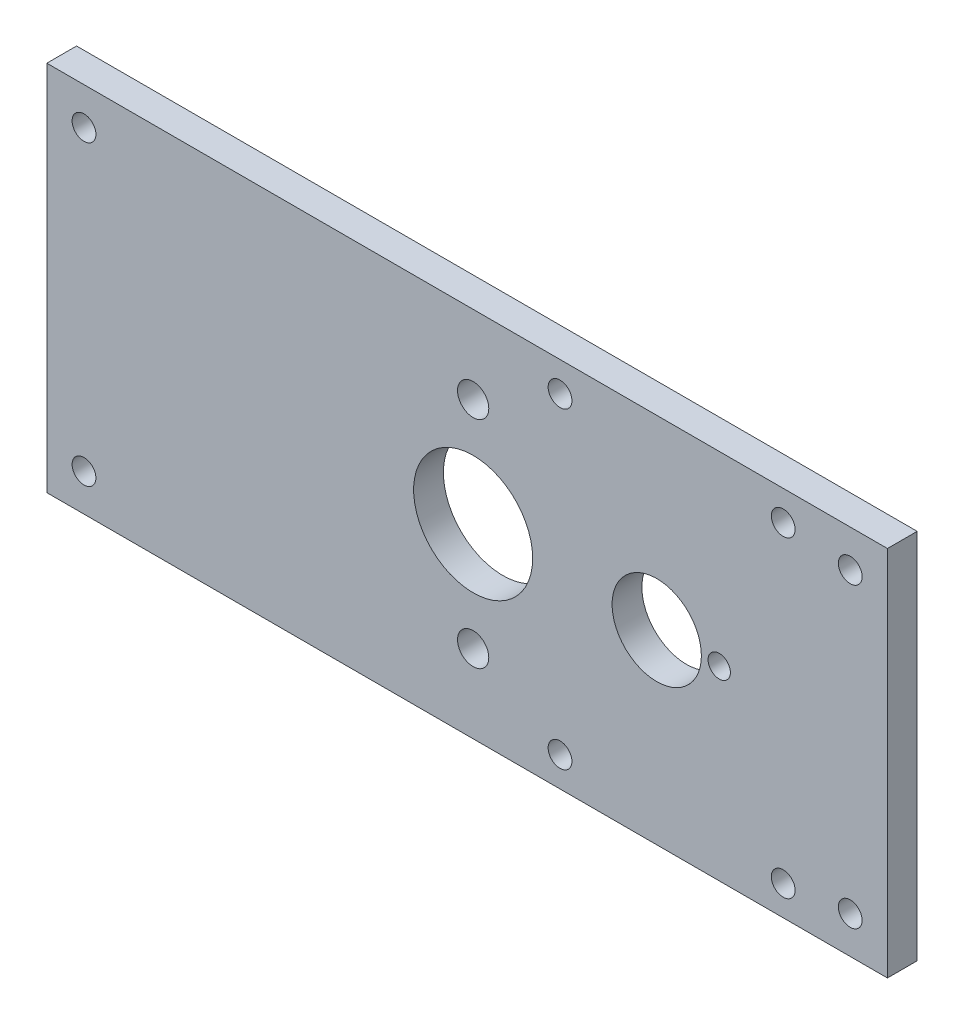
ISO-10303-21;
HEADER;
FILE_DESCRIPTION(('STEP AP214'),'2;1');
FILE_NAME('part.step','',(''),(''),'','','');
FILE_SCHEMA(('AUTOMOTIVE_DESIGN { 1 0 10303 214 1 1 1 1 }'));
ENDSEC;
DATA;
#1=APPLICATION_CONTEXT('core data for automotive mechanical design processes');
#2=APPLICATION_PROTOCOL_DEFINITION('international standard','automotive_design',2000,#1);
#3=PRODUCT_CONTEXT('',#1,'mechanical');
#4=PRODUCT('Part','Part','',(#3));
#5=PRODUCT_RELATED_PRODUCT_CATEGORY('part','',(#4));
#6=PRODUCT_DEFINITION_FORMATION('','',#4);
#7=PRODUCT_DEFINITION_CONTEXT('part definition',#1,'design');
#8=PRODUCT_DEFINITION('design','',#6,#7);
#9=PRODUCT_DEFINITION_SHAPE('','',#8);
#10=(LENGTH_UNIT() NAMED_UNIT(*) SI_UNIT(.MILLI.,.METRE.));
#11=(NAMED_UNIT(*) PLANE_ANGLE_UNIT() SI_UNIT($,.RADIAN.));
#12=(NAMED_UNIT(*) SI_UNIT($,.STERADIAN.) SOLID_ANGLE_UNIT());
#13=UNCERTAINTY_MEASURE_WITH_UNIT(LENGTH_MEASURE(1.E-05),#10,'distance_accuracy_value','');
#14=(GEOMETRIC_REPRESENTATION_CONTEXT(3) GLOBAL_UNCERTAINTY_ASSIGNED_CONTEXT((#13)) GLOBAL_UNIT_ASSIGNED_CONTEXT((#10,
#11,#12)) REPRESENTATION_CONTEXT('',''));
#15=CARTESIAN_POINT('',(0.,0.,0.));
#16=DIRECTION('',(0.,0.,1.));
#17=DIRECTION('',(1.,0.,0.));
#18=AXIS2_PLACEMENT_3D('',#15,#16,#17);
#19=CARTESIAN_POINT('',(0.,0.,4.));
#20=DIRECTION('',(0.,0.,-1.));
#21=DIRECTION('',(-1.,0.,0.));
#22=AXIS2_PLACEMENT_3D('',#19,#20,#21);
#23=PLANE('',#22);
#24=CARTESIAN_POINT('',(57.31,10.5,4.));
#25=DIRECTION('',(0.,0.,1.));
#26=DIRECTION('',(1.,0.,0.));
#27=AXIS2_PLACEMENT_3D('',#24,#25,#26);
#28=CIRCLE('',#27,2.09999999999999);
#29=CARTESIAN_POINT('',(59.41,10.5,4.));
#30=VERTEX_POINT('',#29);
#31=EDGE_CURVE('E159',#30,#30,#28,.T.);
#32=ORIENTED_EDGE('',*,*,#31,.F.);
#33=EDGE_LOOP('',(#32));
#34=FACE_BOUND('',#33,.T.);
#35=CARTESIAN_POINT('',(57.31,39.5,4.));
#36=DIRECTION('',(0.,0.,1.));
#37=DIRECTION('',(1.,0.,0.));
#38=AXIS2_PLACEMENT_3D('',#35,#36,#37);
#39=CIRCLE('',#38,2.09999999999999);
#40=CARTESIAN_POINT('',(59.41,39.5,4.));
#41=VERTEX_POINT('',#40);
#42=EDGE_CURVE('E165',#41,#41,#39,.T.);
#43=ORIENTED_EDGE('',*,*,#42,.F.);
#44=EDGE_LOOP('',(#43));
#45=FACE_BOUND('',#44,.T.);
#46=CARTESIAN_POINT('',(68.99,46.,4.));
#47=DIRECTION('',(0.,0.,1.));
#48=DIRECTION('',(1.,0.,0.));
#49=AXIS2_PLACEMENT_3D('',#46,#47,#48);
#50=CIRCLE('',#49,1.60000000000001);
#51=CARTESIAN_POINT('',(70.59,46.,4.));
#52=VERTEX_POINT('',#51);
#53=EDGE_CURVE('E171',#52,#52,#50,.T.);
#54=ORIENTED_EDGE('',*,*,#53,.F.);
#55=EDGE_LOOP('',(#54));
#56=FACE_BOUND('',#55,.T.);
#57=CARTESIAN_POINT('',(68.99,4.,4.));
#58=DIRECTION('',(0.,0.,1.));
#59=DIRECTION('',(1.,0.,0.));
#60=AXIS2_PLACEMENT_3D('',#57,#58,#59);
#61=CIRCLE('',#60,1.60000000000001);
#62=CARTESIAN_POINT('',(70.59,4.,4.));
#63=VERTEX_POINT('',#62);
#64=EDGE_CURVE('E177',#63,#63,#61,.T.);
#65=ORIENTED_EDGE('',*,*,#64,.F.);
#66=EDGE_LOOP('',(#65));
#67=FACE_BOUND('',#66,.T.);
#68=CARTESIAN_POINT('',(98.99,4.,4.));
#69=DIRECTION('',(0.,0.,1.));
#70=DIRECTION('',(1.,0.,0.));
#71=AXIS2_PLACEMENT_3D('',#68,#69,#70);
#72=CIRCLE('',#71,1.60000000000001);
#73=CARTESIAN_POINT('',(100.59,4.,4.));
#74=VERTEX_POINT('',#73);
#75=EDGE_CURVE('E183',#74,#74,#72,.T.);
#76=ORIENTED_EDGE('',*,*,#75,.F.);
#77=EDGE_LOOP('',(#76));
#78=FACE_BOUND('',#77,.T.);
#79=CARTESIAN_POINT('',(98.99,46.,4.));
#80=DIRECTION('',(0.,0.,1.));
#81=DIRECTION('',(1.,0.,0.));
#82=AXIS2_PLACEMENT_3D('',#79,#80,#81);
#83=CIRCLE('',#82,1.60000000000001);
#84=CARTESIAN_POINT('',(100.59,46.,4.));
#85=VERTEX_POINT('',#84);
#86=EDGE_CURVE('E153',#85,#85,#83,.T.);
#87=ORIENTED_EDGE('',*,*,#86,.F.);
#88=EDGE_LOOP('',(#87));
#89=FACE_BOUND('',#88,.T.);
#90=CARTESIAN_POINT('',(90.39,25.,4.));
#91=DIRECTION('',(0.,0.,1.));
#92=DIRECTION('',(1.,0.,0.));
#93=AXIS2_PLACEMENT_3D('',#90,#91,#92);
#94=CIRCLE('',#93,1.5);
#95=CARTESIAN_POINT('',(91.89,25.,4.));
#96=VERTEX_POINT('',#95);
#97=EDGE_CURVE('E150',#96,#96,#94,.T.);
#98=ORIENTED_EDGE('',*,*,#97,.F.);
#99=EDGE_LOOP('',(#98));
#100=FACE_BOUND('',#99,.T.);
#101=DIRECTION('',(0.,-1.,0.));
#102=VECTOR('',#101,1.);
#103=CARTESIAN_POINT('',(0.,0.,4.));
#104=LINE('',#103,#102);
#105=CARTESIAN_POINT('',(0.,50.,4.));
#106=VERTEX_POINT('',#105);
#107=CARTESIAN_POINT('',(0.,0.,4.));
#108=VERTEX_POINT('',#107);
#109=EDGE_CURVE('E87',#106,#108,#104,.T.);
#110=ORIENTED_EDGE('',*,*,#109,.T.);
#111=DIRECTION('',(1.,0.,0.));
#112=VECTOR('',#111,1.);
#113=CARTESIAN_POINT('',(0.,0.,4.));
#114=LINE('',#113,#112);
#115=CARTESIAN_POINT('',(113.,0.,4.));
#116=VERTEX_POINT('',#115);
#117=EDGE_CURVE('E82',#108,#116,#114,.T.);
#118=ORIENTED_EDGE('',*,*,#117,.T.);
#119=DIRECTION('',(0.,1.,0.));
#120=VECTOR('',#119,1.);
#121=CARTESIAN_POINT('',(113.,0.,4.));
#122=LINE('',#121,#120);
#123=CARTESIAN_POINT('',(113.,50.,4.));
#124=VERTEX_POINT('',#123);
#125=EDGE_CURVE('E85',#116,#124,#122,.T.);
#126=ORIENTED_EDGE('',*,*,#125,.T.);
#127=DIRECTION('',(-1.,0.,0.));
#128=VECTOR('',#127,1.);
#129=CARTESIAN_POINT('',(0.,50.,4.));
#130=LINE('',#129,#128);
#131=EDGE_CURVE('E52',#124,#106,#130,.T.);
#132=ORIENTED_EDGE('',*,*,#131,.T.);
#133=EDGE_LOOP('',(#110,#118,#126,#132));
#134=FACE_BOUND('',#133,.T.);
#135=CARTESIAN_POINT('',(5.,45.,4.));
#136=DIRECTION('',(0.,0.,1.));
#137=DIRECTION('',(1.,0.,0.));
#138=AXIS2_PLACEMENT_3D('',#135,#136,#137);
#139=CIRCLE('',#138,1.6);
#140=CARTESIAN_POINT('',(6.6,45.,4.));
#141=VERTEX_POINT('',#140);
#142=EDGE_CURVE('E102',#141,#141,#139,.T.);
#143=ORIENTED_EDGE('',*,*,#142,.F.);
#144=EDGE_LOOP('',(#143));
#145=FACE_BOUND('',#144,.T.);
#146=CARTESIAN_POINT('',(5.,5.,4.));
#147=DIRECTION('',(0.,0.,1.));
#148=DIRECTION('',(1.,0.,0.));
#149=AXIS2_PLACEMENT_3D('',#146,#147,#148);
#150=CIRCLE('',#149,1.6);
#151=CARTESIAN_POINT('',(6.6,5.,4.));
#152=VERTEX_POINT('',#151);
#153=EDGE_CURVE('E117',#152,#152,#150,.T.);
#154=ORIENTED_EDGE('',*,*,#153,.F.);
#155=EDGE_LOOP('',(#154));
#156=FACE_BOUND('',#155,.T.);
#157=CARTESIAN_POINT('',(108.,45.,4.));
#158=DIRECTION('',(0.,0.,1.));
#159=DIRECTION('',(1.,0.,0.));
#160=AXIS2_PLACEMENT_3D('',#157,#158,#159);
#161=CIRCLE('',#160,1.60000000000002);
#162=CARTESIAN_POINT('',(109.6,45.,4.));
#163=VERTEX_POINT('',#162);
#164=EDGE_CURVE('E123',#163,#163,#161,.T.);
#165=ORIENTED_EDGE('',*,*,#164,.F.);
#166=EDGE_LOOP('',(#165));
#167=FACE_BOUND('',#166,.T.);
#168=CARTESIAN_POINT('',(108.,5.,4.));
#169=DIRECTION('',(0.,0.,1.));
#170=DIRECTION('',(1.,0.,0.));
#171=AXIS2_PLACEMENT_3D('',#168,#169,#170);
#172=CIRCLE('',#171,1.60000000000002);
#173=CARTESIAN_POINT('',(109.6,5.,4.));
#174=VERTEX_POINT('',#173);
#175=EDGE_CURVE('E129',#174,#174,#172,.T.);
#176=ORIENTED_EDGE('',*,*,#175,.F.);
#177=EDGE_LOOP('',(#176));
#178=FACE_BOUND('',#177,.T.);
#179=CARTESIAN_POINT('',(57.31,25.,4.));
#180=DIRECTION('',(0.,0.,1.));
#181=DIRECTION('',(1.,0.,0.));
#182=AXIS2_PLACEMENT_3D('',#179,#180,#181);
#183=CIRCLE('',#182,8.00000000000001);
#184=CARTESIAN_POINT('',(65.31,25.,4.));
#185=VERTEX_POINT('',#184);
#186=EDGE_CURVE('E135',#185,#185,#183,.T.);
#187=ORIENTED_EDGE('',*,*,#186,.F.);
#188=EDGE_LOOP('',(#187));
#189=FACE_BOUND('',#188,.T.);
#190=CARTESIAN_POINT('',(81.99,25.,4.));
#191=DIRECTION('',(0.,0.,1.));
#192=DIRECTION('',(1.,0.,0.));
#193=AXIS2_PLACEMENT_3D('',#190,#191,#192);
#194=CIRCLE('',#193,6.);
#195=CARTESIAN_POINT('',(87.99,25.,4.));
#196=VERTEX_POINT('',#195);
#197=EDGE_CURVE('E141',#196,#196,#194,.T.);
#198=ORIENTED_EDGE('',*,*,#197,.F.);
#199=EDGE_LOOP('',(#198));
#200=FACE_BOUND('',#199,.T.);
#201=ADVANCED_FACE('F35',(#34,#45,#56,#67,#78,#89,#100,#134,#145,#156,#167,#178,#189,#200),#23,.F.);
#202=CARTESIAN_POINT('',(0.,0.,0.));
#203=DIRECTION('',(0.,0.,-1.));
#204=DIRECTION('',(-1.,0.,0.));
#205=AXIS2_PLACEMENT_3D('',#202,#203,#204);
#206=PLANE('',#205);
#207=CARTESIAN_POINT('',(57.31,10.5,0.));
#208=DIRECTION('',(0.,0.,1.));
#209=DIRECTION('',(1.,0.,0.));
#210=AXIS2_PLACEMENT_3D('',#207,#208,#209);
#211=CIRCLE('',#210,2.09999999999999);
#212=CARTESIAN_POINT('',(59.41,10.5,0.));
#213=VERTEX_POINT('',#212);
#214=EDGE_CURVE('E156',#213,#213,#211,.T.);
#215=ORIENTED_EDGE('',*,*,#214,.T.);
#216=EDGE_LOOP('',(#215));
#217=FACE_BOUND('',#216,.T.);
#218=CARTESIAN_POINT('',(57.31,39.5,0.));
#219=DIRECTION('',(0.,0.,1.));
#220=DIRECTION('',(1.,0.,0.));
#221=AXIS2_PLACEMENT_3D('',#218,#219,#220);
#222=CIRCLE('',#221,2.09999999999999);
#223=CARTESIAN_POINT('',(59.41,39.5,0.));
#224=VERTEX_POINT('',#223);
#225=EDGE_CURVE('E162',#224,#224,#222,.T.);
#226=ORIENTED_EDGE('',*,*,#225,.T.);
#227=EDGE_LOOP('',(#226));
#228=FACE_BOUND('',#227,.T.);
#229=CARTESIAN_POINT('',(68.99,46.,0.));
#230=DIRECTION('',(0.,0.,1.));
#231=DIRECTION('',(1.,0.,0.));
#232=AXIS2_PLACEMENT_3D('',#229,#230,#231);
#233=CIRCLE('',#232,1.60000000000001);
#234=CARTESIAN_POINT('',(70.59,46.,0.));
#235=VERTEX_POINT('',#234);
#236=EDGE_CURVE('E168',#235,#235,#233,.T.);
#237=ORIENTED_EDGE('',*,*,#236,.T.);
#238=EDGE_LOOP('',(#237));
#239=FACE_BOUND('',#238,.T.);
#240=CARTESIAN_POINT('',(68.99,4.,0.));
#241=DIRECTION('',(0.,0.,1.));
#242=DIRECTION('',(1.,0.,0.));
#243=AXIS2_PLACEMENT_3D('',#240,#241,#242);
#244=CIRCLE('',#243,1.60000000000001);
#245=CARTESIAN_POINT('',(70.59,4.,0.));
#246=VERTEX_POINT('',#245);
#247=EDGE_CURVE('E174',#246,#246,#244,.T.);
#248=ORIENTED_EDGE('',*,*,#247,.T.);
#249=EDGE_LOOP('',(#248));
#250=FACE_BOUND('',#249,.T.);
#251=CARTESIAN_POINT('',(98.99,4.,0.));
#252=DIRECTION('',(0.,0.,1.));
#253=DIRECTION('',(1.,0.,0.));
#254=AXIS2_PLACEMENT_3D('',#251,#252,#253);
#255=CIRCLE('',#254,1.60000000000001);
#256=CARTESIAN_POINT('',(100.59,4.,0.));
#257=VERTEX_POINT('',#256);
#258=EDGE_CURVE('E180',#257,#257,#255,.T.);
#259=ORIENTED_EDGE('',*,*,#258,.T.);
#260=EDGE_LOOP('',(#259));
#261=FACE_BOUND('',#260,.T.);
#262=CARTESIAN_POINT('',(98.99,46.,0.));
#263=DIRECTION('',(0.,0.,1.));
#264=DIRECTION('',(1.,0.,0.));
#265=AXIS2_PLACEMENT_3D('',#262,#263,#264);
#266=CIRCLE('',#265,1.60000000000001);
#267=CARTESIAN_POINT('',(100.59,46.,0.));
#268=VERTEX_POINT('',#267);
#269=EDGE_CURVE('E186',#268,#268,#266,.T.);
#270=ORIENTED_EDGE('',*,*,#269,.T.);
#271=EDGE_LOOP('',(#270));
#272=FACE_BOUND('',#271,.T.);
#273=CARTESIAN_POINT('',(90.39,25.,0.));
#274=DIRECTION('',(0.,0.,1.));
#275=DIRECTION('',(1.,0.,0.));
#276=AXIS2_PLACEMENT_3D('',#273,#274,#275);
#277=CIRCLE('',#276,1.5);
#278=CARTESIAN_POINT('',(91.89,25.,0.));
#279=VERTEX_POINT('',#278);
#280=EDGE_CURVE('E147',#279,#279,#277,.T.);
#281=ORIENTED_EDGE('',*,*,#280,.T.);
#282=EDGE_LOOP('',(#281));
#283=FACE_BOUND('',#282,.T.);
#284=CARTESIAN_POINT('',(57.31,25.,0.));
#285=DIRECTION('',(0.,0.,1.));
#286=DIRECTION('',(1.,0.,0.));
#287=AXIS2_PLACEMENT_3D('',#284,#285,#286);
#288=CIRCLE('',#287,8.00000000000001);
#289=CARTESIAN_POINT('',(65.31,25.,0.));
#290=VERTEX_POINT('',#289);
#291=EDGE_CURVE('E138',#290,#290,#288,.T.);
#292=ORIENTED_EDGE('',*,*,#291,.T.);
#293=EDGE_LOOP('',(#292));
#294=FACE_BOUND('',#293,.T.);
#295=CARTESIAN_POINT('',(108.,45.,0.));
#296=DIRECTION('',(0.,0.,1.));
#297=DIRECTION('',(1.,0.,0.));
#298=AXIS2_PLACEMENT_3D('',#295,#296,#297);
#299=CIRCLE('',#298,1.60000000000002);
#300=CARTESIAN_POINT('',(109.6,45.,0.));
#301=VERTEX_POINT('',#300);
#302=EDGE_CURVE('E126',#301,#301,#299,.T.);
#303=ORIENTED_EDGE('',*,*,#302,.T.);
#304=EDGE_LOOP('',(#303));
#305=FACE_BOUND('',#304,.T.);
#306=CARTESIAN_POINT('',(5.,45.,0.));
#307=DIRECTION('',(0.,0.,1.));
#308=DIRECTION('',(1.,0.,0.));
#309=AXIS2_PLACEMENT_3D('',#306,#307,#308);
#310=CIRCLE('',#309,1.6);
#311=CARTESIAN_POINT('',(6.6,45.,0.));
#312=VERTEX_POINT('',#311);
#313=EDGE_CURVE('E114',#312,#312,#310,.T.);
#314=ORIENTED_EDGE('',*,*,#313,.T.);
#315=EDGE_LOOP('',(#314));
#316=FACE_BOUND('',#315,.T.);
#317=DIRECTION('',(0.,-1.,0.));
#318=VECTOR('',#317,1.);
#319=CARTESIAN_POINT('',(0.,0.,0.));
#320=LINE('',#319,#318);
#321=CARTESIAN_POINT('',(0.,50.,0.));
#322=VERTEX_POINT('',#321);
#323=CARTESIAN_POINT('',(0.,0.,0.));
#324=VERTEX_POINT('',#323);
#325=EDGE_CURVE('E99',#322,#324,#320,.T.);
#326=ORIENTED_EDGE('',*,*,#325,.F.);
#327=DIRECTION('',(-1.,0.,0.));
#328=VECTOR('',#327,1.);
#329=CARTESIAN_POINT('',(0.,50.,0.));
#330=LINE('',#329,#328);
#331=CARTESIAN_POINT('',(113.,50.,0.));
#332=VERTEX_POINT('',#331);
#333=EDGE_CURVE('E75',#332,#322,#330,.T.);
#334=ORIENTED_EDGE('',*,*,#333,.F.);
#335=DIRECTION('',(0.,1.,0.));
#336=VECTOR('',#335,1.);
#337=CARTESIAN_POINT('',(113.,0.,0.));
#338=LINE('',#337,#336);
#339=CARTESIAN_POINT('',(113.,0.,0.));
#340=VERTEX_POINT('',#339);
#341=EDGE_CURVE('E69',#340,#332,#338,.T.);
#342=ORIENTED_EDGE('',*,*,#341,.F.);
#343=DIRECTION('',(1.,0.,0.));
#344=VECTOR('',#343,1.);
#345=CARTESIAN_POINT('',(0.,0.,0.));
#346=LINE('',#345,#344);
#347=EDGE_CURVE('E91',#324,#340,#346,.T.);
#348=ORIENTED_EDGE('',*,*,#347,.F.);
#349=EDGE_LOOP('',(#326,#334,#342,#348));
#350=FACE_BOUND('',#349,.T.);
#351=CARTESIAN_POINT('',(5.,5.,0.));
#352=DIRECTION('',(0.,0.,1.));
#353=DIRECTION('',(1.,0.,0.));
#354=AXIS2_PLACEMENT_3D('',#351,#352,#353);
#355=CIRCLE('',#354,1.6);
#356=CARTESIAN_POINT('',(6.6,5.,0.));
#357=VERTEX_POINT('',#356);
#358=EDGE_CURVE('E120',#357,#357,#355,.T.);
#359=ORIENTED_EDGE('',*,*,#358,.T.);
#360=EDGE_LOOP('',(#359));
#361=FACE_BOUND('',#360,.T.);
#362=CARTESIAN_POINT('',(108.,5.,0.));
#363=DIRECTION('',(0.,0.,1.));
#364=DIRECTION('',(1.,0.,0.));
#365=AXIS2_PLACEMENT_3D('',#362,#363,#364);
#366=CIRCLE('',#365,1.60000000000002);
#367=CARTESIAN_POINT('',(109.6,5.,0.));
#368=VERTEX_POINT('',#367);
#369=EDGE_CURVE('E132',#368,#368,#366,.T.);
#370=ORIENTED_EDGE('',*,*,#369,.T.);
#371=EDGE_LOOP('',(#370));
#372=FACE_BOUND('',#371,.T.);
#373=CARTESIAN_POINT('',(81.99,25.,0.));
#374=DIRECTION('',(0.,0.,1.));
#375=DIRECTION('',(1.,0.,0.));
#376=AXIS2_PLACEMENT_3D('',#373,#374,#375);
#377=CIRCLE('',#376,6.);
#378=CARTESIAN_POINT('',(87.99,25.,0.));
#379=VERTEX_POINT('',#378);
#380=EDGE_CURVE('E144',#379,#379,#377,.T.);
#381=ORIENTED_EDGE('',*,*,#380,.T.);
#382=EDGE_LOOP('',(#381));
#383=FACE_BOUND('',#382,.T.);
#384=ADVANCED_FACE('F110',(#217,#228,#239,#250,#261,#272,#283,#294,#305,#316,#350,#361,#372,
#383),#206,.T.);
#385=CARTESIAN_POINT('',(0.,0.,4.));
#386=DIRECTION('',(1.,0.,0.));
#387=DIRECTION('',(0.,0.,-1.));
#388=AXIS2_PLACEMENT_3D('',#385,#386,#387);
#389=PLANE('',#388);
#390=ORIENTED_EDGE('',*,*,#325,.T.);
#391=DIRECTION('',(0.,0.,-1.));
#392=VECTOR('',#391,1.);
#393=CARTESIAN_POINT('',(0.,0.,4.));
#394=LINE('',#393,#392);
#395=EDGE_CURVE('E11',#108,#324,#394,.T.);
#396=ORIENTED_EDGE('',*,*,#395,.F.);
#397=ORIENTED_EDGE('',*,*,#109,.F.);
#398=DIRECTION('',(0.,0.,-1.));
#399=VECTOR('',#398,1.);
#400=CARTESIAN_POINT('',(0.,50.,4.));
#401=LINE('',#400,#399);
#402=EDGE_CURVE('E95',#106,#322,#401,.T.);
#403=ORIENTED_EDGE('',*,*,#402,.T.);
#404=EDGE_LOOP('',(#390,#396,#397,#403));
#405=FACE_BOUND('',#404,.T.);
#406=ADVANCED_FACE('F37',(#405),#389,.F.);
#407=CARTESIAN_POINT('',(0.,0.,4.));
#408=DIRECTION('',(0.,1.,0.));
#409=DIRECTION('',(0.,0.,1.));
#410=AXIS2_PLACEMENT_3D('',#407,#408,#409);
#411=PLANE('',#410);
#412=ORIENTED_EDGE('',*,*,#347,.T.);
#413=DIRECTION('',(0.,0.,-1.));
#414=VECTOR('',#413,1.);
#415=CARTESIAN_POINT('',(113.,0.,4.));
#416=LINE('',#415,#414);
#417=EDGE_CURVE('E44',#116,#340,#416,.T.);
#418=ORIENTED_EDGE('',*,*,#417,.F.);
#419=ORIENTED_EDGE('',*,*,#117,.F.);
#420=ORIENTED_EDGE('',*,*,#395,.T.);
#421=EDGE_LOOP('',(#412,#418,#419,#420));
#422=FACE_BOUND('',#421,.T.);
#423=ADVANCED_FACE('F90',(#422),#411,.F.);
#424=CARTESIAN_POINT('',(113.,0.,4.));
#425=DIRECTION('',(-1.,0.,0.));
#426=DIRECTION('',(0.,0.,1.));
#427=AXIS2_PLACEMENT_3D('',#424,#425,#426);
#428=PLANE('',#427);
#429=ORIENTED_EDGE('',*,*,#341,.T.);
#430=DIRECTION('',(0.,0.,-1.));
#431=VECTOR('',#430,1.);
#432=CARTESIAN_POINT('',(113.,50.,4.));
#433=LINE('',#432,#431);
#434=EDGE_CURVE('E92',#124,#332,#433,.T.);
#435=ORIENTED_EDGE('',*,*,#434,.F.);
#436=ORIENTED_EDGE('',*,*,#125,.F.);
#437=ORIENTED_EDGE('',*,*,#417,.T.);
#438=EDGE_LOOP('',(#429,#435,#436,#437));
#439=FACE_BOUND('',#438,.T.);
#440=ADVANCED_FACE('F93',(#439),#428,.F.);
#441=CARTESIAN_POINT('',(0.,50.,4.));
#442=DIRECTION('',(0.,-1.,0.));
#443=DIRECTION('',(0.,0.,-1.));
#444=AXIS2_PLACEMENT_3D('',#441,#442,#443);
#445=PLANE('',#444);
#446=ORIENTED_EDGE('',*,*,#333,.T.);
#447=ORIENTED_EDGE('',*,*,#402,.F.);
#448=ORIENTED_EDGE('',*,*,#131,.F.);
#449=ORIENTED_EDGE('',*,*,#434,.T.);
#450=EDGE_LOOP('',(#446,#447,#448,#449));
#451=FACE_BOUND('',#450,.T.);
#452=ADVANCED_FACE('F107',(#451),#445,.F.);
#453=CARTESIAN_POINT('',(5.,45.,4.));
#454=DIRECTION('',(0.,0.,-1.));
#455=DIRECTION('',(-1.,0.,0.));
#456=AXIS2_PLACEMENT_3D('',#453,#454,#455);
#457=CYLINDRICAL_SURFACE('',#456,1.6);
#458=ORIENTED_EDGE('',*,*,#142,.T.);
#459=EDGE_LOOP('',(#458));
#460=FACE_BOUND('',#459,.T.);
#461=ORIENTED_EDGE('',*,*,#313,.F.);
#462=EDGE_LOOP('',(#461));
#463=FACE_BOUND('',#462,.T.);
#464=ADVANCED_FACE('F234',(#460,#463),#457,.F.);
#465=CARTESIAN_POINT('',(5.,5.,4.));
#466=DIRECTION('',(0.,0.,-1.));
#467=DIRECTION('',(-1.,0.,0.));
#468=AXIS2_PLACEMENT_3D('',#465,#466,#467);
#469=CYLINDRICAL_SURFACE('',#468,1.6);
#470=ORIENTED_EDGE('',*,*,#153,.T.);
#471=EDGE_LOOP('',(#470));
#472=FACE_BOUND('',#471,.T.);
#473=ORIENTED_EDGE('',*,*,#358,.F.);
#474=EDGE_LOOP('',(#473));
#475=FACE_BOUND('',#474,.T.);
#476=ADVANCED_FACE('F230',(#472,#475),#469,.F.);
#477=CARTESIAN_POINT('',(108.,45.,4.));
#478=DIRECTION('',(0.,0.,-1.));
#479=DIRECTION('',(-1.,0.,0.));
#480=AXIS2_PLACEMENT_3D('',#477,#478,#479);
#481=CYLINDRICAL_SURFACE('',#480,1.60000000000002);
#482=ORIENTED_EDGE('',*,*,#164,.T.);
#483=EDGE_LOOP('',(#482));
#484=FACE_BOUND('',#483,.T.);
#485=ORIENTED_EDGE('',*,*,#302,.F.);
#486=EDGE_LOOP('',(#485));
#487=FACE_BOUND('',#486,.T.);
#488=ADVANCED_FACE('F226',(#484,#487),#481,.F.);
#489=CARTESIAN_POINT('',(108.,5.,4.));
#490=DIRECTION('',(0.,0.,-1.));
#491=DIRECTION('',(-1.,0.,0.));
#492=AXIS2_PLACEMENT_3D('',#489,#490,#491);
#493=CYLINDRICAL_SURFACE('',#492,1.60000000000002);
#494=ORIENTED_EDGE('',*,*,#175,.T.);
#495=EDGE_LOOP('',(#494));
#496=FACE_BOUND('',#495,.T.);
#497=ORIENTED_EDGE('',*,*,#369,.F.);
#498=EDGE_LOOP('',(#497));
#499=FACE_BOUND('',#498,.T.);
#500=ADVANCED_FACE('F222',(#496,#499),#493,.F.);
#501=CARTESIAN_POINT('',(57.31,25.,4.));
#502=DIRECTION('',(0.,0.,-1.));
#503=DIRECTION('',(-1.,0.,0.));
#504=AXIS2_PLACEMENT_3D('',#501,#502,#503);
#505=CYLINDRICAL_SURFACE('',#504,8.00000000000001);
#506=ORIENTED_EDGE('',*,*,#186,.T.);
#507=EDGE_LOOP('',(#506));
#508=FACE_BOUND('',#507,.T.);
#509=ORIENTED_EDGE('',*,*,#291,.F.);
#510=EDGE_LOOP('',(#509));
#511=FACE_BOUND('',#510,.T.);
#512=ADVANCED_FACE('F212',(#508,#511),#505,.F.);
#513=CARTESIAN_POINT('',(81.99,25.,4.));
#514=DIRECTION('',(0.,0.,-1.));
#515=DIRECTION('',(-1.,0.,0.));
#516=AXIS2_PLACEMENT_3D('',#513,#514,#515);
#517=CYLINDRICAL_SURFACE('',#516,6.);
#518=ORIENTED_EDGE('',*,*,#197,.T.);
#519=EDGE_LOOP('',(#518));
#520=FACE_BOUND('',#519,.T.);
#521=ORIENTED_EDGE('',*,*,#380,.F.);
#522=EDGE_LOOP('',(#521));
#523=FACE_BOUND('',#522,.T.);
#524=ADVANCED_FACE('F202',(#520,#523),#517,.F.);
#525=CARTESIAN_POINT('',(90.39,25.,0.));
#526=DIRECTION('',(0.,0.,1.));
#527=DIRECTION('',(1.,0.,0.));
#528=AXIS2_PLACEMENT_3D('',#525,#526,#527);
#529=CYLINDRICAL_SURFACE('',#528,1.5);
#530=ORIENTED_EDGE('',*,*,#280,.F.);
#531=EDGE_LOOP('',(#530));
#532=FACE_BOUND('',#531,.T.);
#533=ORIENTED_EDGE('',*,*,#97,.T.);
#534=EDGE_LOOP('',(#533));
#535=FACE_BOUND('',#534,.T.);
#536=ADVANCED_FACE('F200',(#532,#535),#529,.F.);
#537=CARTESIAN_POINT('',(98.99,46.,0.));
#538=DIRECTION('',(0.,0.,1.));
#539=DIRECTION('',(1.,0.,0.));
#540=AXIS2_PLACEMENT_3D('',#537,#538,#539);
#541=CYLINDRICAL_SURFACE('',#540,1.60000000000001);
#542=ORIENTED_EDGE('',*,*,#269,.F.);
#543=EDGE_LOOP('',(#542));
#544=FACE_BOUND('',#543,.T.);
#545=ORIENTED_EDGE('',*,*,#86,.T.);
#546=EDGE_LOOP('',(#545));
#547=FACE_BOUND('',#546,.T.);
#548=ADVANCED_FACE('F192',(#544,#547),#541,.F.);
#549=CARTESIAN_POINT('',(98.99,4.,0.));
#550=DIRECTION('',(0.,0.,1.));
#551=DIRECTION('',(1.,0.,0.));
#552=AXIS2_PLACEMENT_3D('',#549,#550,#551);
#553=CYLINDRICAL_SURFACE('',#552,1.60000000000001);
#554=ORIENTED_EDGE('',*,*,#258,.F.);
#555=EDGE_LOOP('',(#554));
#556=FACE_BOUND('',#555,.T.);
#557=ORIENTED_EDGE('',*,*,#75,.T.);
#558=EDGE_LOOP('',(#557));
#559=FACE_BOUND('',#558,.T.);
#560=ADVANCED_FACE('F209',(#556,#559),#553,.F.);
#561=CARTESIAN_POINT('',(68.99,4.,0.));
#562=DIRECTION('',(0.,0.,1.));
#563=DIRECTION('',(1.,0.,0.));
#564=AXIS2_PLACEMENT_3D('',#561,#562,#563);
#565=CYLINDRICAL_SURFACE('',#564,1.60000000000001);
#566=ORIENTED_EDGE('',*,*,#247,.F.);
#567=EDGE_LOOP('',(#566));
#568=FACE_BOUND('',#567,.T.);
#569=ORIENTED_EDGE('',*,*,#64,.T.);
#570=EDGE_LOOP('',(#569));
#571=FACE_BOUND('',#570,.T.);
#572=ADVANCED_FACE('F334',(#568,#571),#565,.F.);
#573=CARTESIAN_POINT('',(68.99,46.,0.));
#574=DIRECTION('',(0.,0.,1.));
#575=DIRECTION('',(1.,0.,0.));
#576=AXIS2_PLACEMENT_3D('',#573,#574,#575);
#577=CYLINDRICAL_SURFACE('',#576,1.60000000000001);
#578=ORIENTED_EDGE('',*,*,#236,.F.);
#579=EDGE_LOOP('',(#578));
#580=FACE_BOUND('',#579,.T.);
#581=ORIENTED_EDGE('',*,*,#53,.T.);
#582=EDGE_LOOP('',(#581));
#583=FACE_BOUND('',#582,.T.);
#584=ADVANCED_FACE('F343',(#580,#583),#577,.F.);
#585=CARTESIAN_POINT('',(57.31,39.5,0.));
#586=DIRECTION('',(0.,0.,1.));
#587=DIRECTION('',(1.,0.,0.));
#588=AXIS2_PLACEMENT_3D('',#585,#586,#587);
#589=CYLINDRICAL_SURFACE('',#588,2.09999999999999);
#590=ORIENTED_EDGE('',*,*,#225,.F.);
#591=EDGE_LOOP('',(#590));
#592=FACE_BOUND('',#591,.T.);
#593=ORIENTED_EDGE('',*,*,#42,.T.);
#594=EDGE_LOOP('',(#593));
#595=FACE_BOUND('',#594,.T.);
#596=ADVANCED_FACE('F352',(#592,#595),#589,.F.);
#597=CARTESIAN_POINT('',(57.31,10.5,0.));
#598=DIRECTION('',(0.,0.,1.));
#599=DIRECTION('',(1.,0.,0.));
#600=AXIS2_PLACEMENT_3D('',#597,#598,#599);
#601=CYLINDRICAL_SURFACE('',#600,2.09999999999999);
#602=ORIENTED_EDGE('',*,*,#214,.F.);
#603=EDGE_LOOP('',(#602));
#604=FACE_BOUND('',#603,.T.);
#605=ORIENTED_EDGE('',*,*,#31,.T.);
#606=EDGE_LOOP('',(#605));
#607=FACE_BOUND('',#606,.T.);
#608=ADVANCED_FACE('F217',(#604,#607),#601,.F.);
#609=CLOSED_SHELL('',(#201,#384,#406,#423,#440,#452,#464,#476,#488,#500,#512,#524,#536,#548,
#560,#572,#584,#596,#608));
#610=MANIFOLD_SOLID_BREP('B2',#609);
#611=ADVANCED_BREP_SHAPE_REPRESENTATION('',(#18,#610),#14);
#612=SHAPE_DEFINITION_REPRESENTATION(#9,#611);
ENDSEC;
END-ISO-10303-21;
